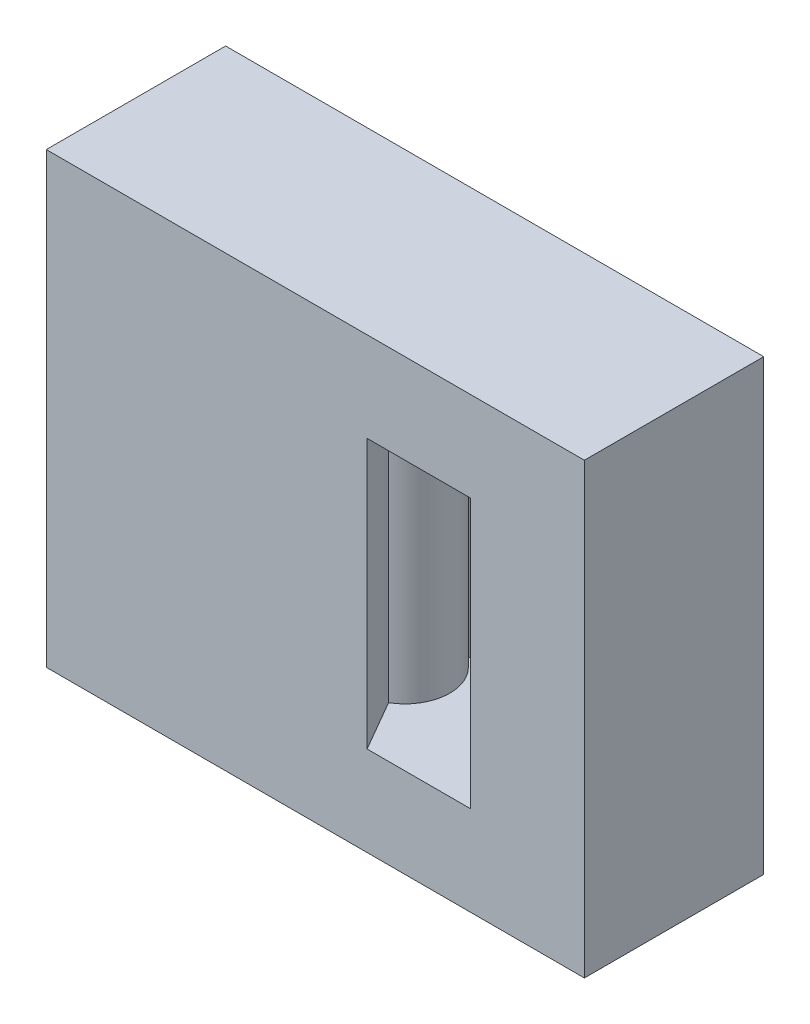
ISO-10303-21;
HEADER;
FILE_DESCRIPTION(('STEP AP214'),'2;1');
FILE_NAME('part.step','',(''),(''),'','','');
FILE_SCHEMA(('AUTOMOTIVE_DESIGN { 1 0 10303 214 1 1 1 1 }'));
ENDSEC;
DATA;
#1=APPLICATION_CONTEXT('core data for automotive mechanical design processes');
#2=APPLICATION_PROTOCOL_DEFINITION('international standard','automotive_design',2000,#1);
#3=PRODUCT_CONTEXT('',#1,'mechanical');
#4=PRODUCT('Part','Part','',(#3));
#5=PRODUCT_RELATED_PRODUCT_CATEGORY('part','',(#4));
#6=PRODUCT_DEFINITION_FORMATION('','',#4);
#7=PRODUCT_DEFINITION_CONTEXT('part definition',#1,'design');
#8=PRODUCT_DEFINITION('design','',#6,#7);
#9=PRODUCT_DEFINITION_SHAPE('','',#8);
#10=(LENGTH_UNIT() NAMED_UNIT(*) SI_UNIT(.MILLI.,.METRE.));
#11=(NAMED_UNIT(*) PLANE_ANGLE_UNIT() SI_UNIT($,.RADIAN.));
#12=(NAMED_UNIT(*) SI_UNIT($,.STERADIAN.) SOLID_ANGLE_UNIT());
#13=UNCERTAINTY_MEASURE_WITH_UNIT(LENGTH_MEASURE(1.E-05),#10,'distance_accuracy_value','');
#14=(GEOMETRIC_REPRESENTATION_CONTEXT(3) GLOBAL_UNCERTAINTY_ASSIGNED_CONTEXT((#13)) GLOBAL_UNIT_ASSIGNED_CONTEXT((#10,
#11,#12)) REPRESENTATION_CONTEXT('',''));
#15=CARTESIAN_POINT('',(0.,0.,0.));
#16=DIRECTION('',(0.,0.,1.));
#17=DIRECTION('',(1.,0.,0.));
#18=AXIS2_PLACEMENT_3D('',#15,#16,#17);
#19=CARTESIAN_POINT('',(-30.,40.,10.));
#20=DIRECTION('',(1.,0.,0.));
#21=DIRECTION('',(0.,0.,-1.));
#22=AXIS2_PLACEMENT_3D('',#19,#20,#21);
#23=PLANE('',#22);
#24=DIRECTION('',(0.,-1.,0.));
#25=VECTOR('',#24,1.);
#26=CARTESIAN_POINT('',(-30.,40.,-10.));
#27=LINE('',#26,#25);
#28=CARTESIAN_POINT('',(-30.,40.,-10.));
#29=VERTEX_POINT('',#28);
#30=CARTESIAN_POINT('',(-30.,-10.,-10.));
#31=VERTEX_POINT('',#30);
#32=EDGE_CURVE('E154',#29,#31,#27,.T.);
#33=ORIENTED_EDGE('',*,*,#32,.T.);
#34=DIRECTION('',(0.,0.,-1.));
#35=VECTOR('',#34,1.);
#36=CARTESIAN_POINT('',(-30.,-10.,10.));
#37=LINE('',#36,#35);
#38=CARTESIAN_POINT('',(-30.,-10.,10.));
#39=VERTEX_POINT('',#38);
#40=EDGE_CURVE('E181',#39,#31,#37,.T.);
#41=ORIENTED_EDGE('',*,*,#40,.F.);
#42=DIRECTION('',(0.,-1.,0.));
#43=VECTOR('',#42,1.);
#44=CARTESIAN_POINT('',(-30.,40.,10.));
#45=LINE('',#44,#43);
#46=CARTESIAN_POINT('',(-30.,40.,10.));
#47=VERTEX_POINT('',#46);
#48=EDGE_CURVE('E155',#47,#39,#45,.T.);
#49=ORIENTED_EDGE('',*,*,#48,.F.);
#50=DIRECTION('',(0.,0.,-1.));
#51=VECTOR('',#50,1.);
#52=CARTESIAN_POINT('',(-30.,40.,10.));
#53=LINE('',#52,#51);
#54=EDGE_CURVE('E165',#47,#29,#53,.T.);
#55=ORIENTED_EDGE('',*,*,#54,.T.);
#56=EDGE_LOOP('',(#33,#41,#49,#55));
#57=FACE_BOUND('',#56,.T.);
#58=ADVANCED_FACE('F41',(#57),#23,.F.);
#59=CARTESIAN_POINT('',(-30.,-10.,10.));
#60=DIRECTION('',(0.,1.,0.));
#61=DIRECTION('',(0.,0.,1.));
#62=AXIS2_PLACEMENT_3D('',#59,#60,#61);
#63=PLANE('',#62);
#64=DIRECTION('',(1.,0.,0.));
#65=VECTOR('',#64,1.);
#66=CARTESIAN_POINT('',(-30.,-10.,-10.));
#67=LINE('',#66,#65);
#68=CARTESIAN_POINT('',(30.,-10.,-10.));
#69=VERTEX_POINT('',#68);
#70=EDGE_CURVE('E168',#31,#69,#67,.T.);
#71=ORIENTED_EDGE('',*,*,#70,.T.);
#72=DIRECTION('',(0.,0.,-1.));
#73=VECTOR('',#72,1.);
#74=CARTESIAN_POINT('',(30.,-10.,10.));
#75=LINE('',#74,#73);
#76=CARTESIAN_POINT('',(30.,-10.,10.));
#77=VERTEX_POINT('',#76);
#78=EDGE_CURVE('E178',#77,#69,#75,.T.);
#79=ORIENTED_EDGE('',*,*,#78,.F.);
#80=DIRECTION('',(1.,0.,0.));
#81=VECTOR('',#80,1.);
#82=CARTESIAN_POINT('',(-30.,-10.,10.));
#83=LINE('',#82,#81);
#84=EDGE_CURVE('E158',#39,#77,#83,.T.);
#85=ORIENTED_EDGE('',*,*,#84,.F.);
#86=ORIENTED_EDGE('',*,*,#40,.T.);
#87=EDGE_LOOP('',(#71,#79,#85,#86));
#88=FACE_BOUND('',#87,.T.);
#89=ADVANCED_FACE('F219',(#88),#63,.F.);
#90=CARTESIAN_POINT('',(30.,-10.,10.));
#91=DIRECTION('',(-1.,0.,0.));
#92=DIRECTION('',(0.,0.,1.));
#93=AXIS2_PLACEMENT_3D('',#90,#91,#92);
#94=PLANE('',#93);
#95=DIRECTION('',(0.,1.,0.));
#96=VECTOR('',#95,1.);
#97=CARTESIAN_POINT('',(30.,-10.,-10.));
#98=LINE('',#97,#96);
#99=CARTESIAN_POINT('',(30.,40.,-10.));
#100=VERTEX_POINT('',#99);
#101=EDGE_CURVE('E170',#69,#100,#98,.T.);
#102=ORIENTED_EDGE('',*,*,#101,.T.);
#103=DIRECTION('',(0.,0.,-1.));
#104=VECTOR('',#103,1.);
#105=CARTESIAN_POINT('',(30.,40.,10.));
#106=LINE('',#105,#104);
#107=CARTESIAN_POINT('',(30.,40.,10.));
#108=VERTEX_POINT('',#107);
#109=EDGE_CURVE('E175',#108,#100,#106,.T.);
#110=ORIENTED_EDGE('',*,*,#109,.F.);
#111=DIRECTION('',(0.,1.,0.));
#112=VECTOR('',#111,1.);
#113=CARTESIAN_POINT('',(30.,-10.,10.));
#114=LINE('',#113,#112);
#115=EDGE_CURVE('E161',#77,#108,#114,.T.);
#116=ORIENTED_EDGE('',*,*,#115,.F.);
#117=ORIENTED_EDGE('',*,*,#78,.T.);
#118=EDGE_LOOP('',(#102,#110,#116,#117));
#119=FACE_BOUND('',#118,.T.);
#120=ADVANCED_FACE('F224',(#119),#94,.F.);
#121=CARTESIAN_POINT('',(30.,40.,10.));
#122=DIRECTION('',(0.,-1.,0.));
#123=DIRECTION('',(0.,0.,-1.));
#124=AXIS2_PLACEMENT_3D('',#121,#122,#123);
#125=PLANE('',#124);
#126=DIRECTION('',(-1.,0.,0.));
#127=VECTOR('',#126,1.);
#128=CARTESIAN_POINT('',(30.,40.,-10.));
#129=LINE('',#128,#127);
#130=EDGE_CURVE('E159',#100,#29,#129,.T.);
#131=ORIENTED_EDGE('',*,*,#130,.T.);
#132=ORIENTED_EDGE('',*,*,#54,.F.);
#133=DIRECTION('',(-1.,0.,0.));
#134=VECTOR('',#133,1.);
#135=CARTESIAN_POINT('',(30.,40.,10.));
#136=LINE('',#135,#134);
#137=EDGE_CURVE('E163',#108,#47,#136,.T.);
#138=ORIENTED_EDGE('',*,*,#137,.F.);
#139=ORIENTED_EDGE('',*,*,#109,.T.);
#140=EDGE_LOOP('',(#131,#132,#138,#139));
#141=FACE_BOUND('',#140,.T.);
#142=ADVANCED_FACE('F237',(#141),#125,.F.);
#143=CARTESIAN_POINT('',(0.,0.,10.));
#144=DIRECTION('',(0.,0.,1.));
#145=DIRECTION('',(1.,0.,0.));
#146=AXIS2_PLACEMENT_3D('',#143,#144,#145);
#147=PLANE('',#146);
#148=DIRECTION('',(1.,0.,0.));
#149=VECTOR('',#148,1.);
#150=CARTESIAN_POINT('',(0.,0.,10.));
#151=LINE('',#150,#149);
#152=CARTESIAN_POINT('',(5.77350269189626,0.,10.));
#153=VERTEX_POINT('',#152);
#154=CARTESIAN_POINT('',(17.3205080756888,0.,10.));
#155=VERTEX_POINT('',#154);
#156=EDGE_CURVE('E152',#153,#155,#151,.T.);
#157=ORIENTED_EDGE('',*,*,#156,.F.);
#158=DIRECTION('',(0.,-1.,0.));
#159=VECTOR('',#158,1.);
#160=CARTESIAN_POINT('',(5.77350269189626,0.,10.));
#161=LINE('',#160,#159);
#162=CARTESIAN_POINT('',(5.77350269189626,30.,10.));
#163=VERTEX_POINT('',#162);
#164=EDGE_CURVE('E11',#163,#153,#161,.T.);
#165=ORIENTED_EDGE('',*,*,#164,.F.);
#166=DIRECTION('',(-1.,0.,0.));
#167=VECTOR('',#166,1.);
#168=CARTESIAN_POINT('',(0.,30.,10.));
#169=LINE('',#168,#167);
#170=CARTESIAN_POINT('',(17.3205080756888,30.,10.));
#171=VERTEX_POINT('',#170);
#172=EDGE_CURVE('E124',#171,#163,#169,.T.);
#173=ORIENTED_EDGE('',*,*,#172,.F.);
#174=DIRECTION('',(0.,-1.,0.));
#175=VECTOR('',#174,1.);
#176=CARTESIAN_POINT('',(17.3205080756888,0.,10.));
#177=LINE('',#176,#175);
#178=EDGE_CURVE('E150',#155,#171,#177,.F.);
#179=ORIENTED_EDGE('',*,*,#178,.F.);
#180=EDGE_LOOP('',(#157,#165,#173,#179));
#181=FACE_BOUND('',#180,.T.);
#182=ORIENTED_EDGE('',*,*,#48,.T.);
#183=ORIENTED_EDGE('',*,*,#84,.T.);
#184=ORIENTED_EDGE('',*,*,#115,.T.);
#185=ORIENTED_EDGE('',*,*,#137,.T.);
#186=EDGE_LOOP('',(#182,#183,#184,#185));
#187=FACE_BOUND('',#186,.T.);
#188=ADVANCED_FACE('F203',(#181,#187),#147,.T.);
#189=CARTESIAN_POINT('',(0.,0.,-10.));
#190=DIRECTION('',(0.,0.,1.));
#191=DIRECTION('',(1.,0.,0.));
#192=AXIS2_PLACEMENT_3D('',#189,#190,#191);
#193=PLANE('',#192);
#194=DIRECTION('',(0.,1.,0.));
#195=VECTOR('',#194,1.);
#196=CARTESIAN_POINT('',(5.77350269189626,0.,-10.));
#197=LINE('',#196,#195);
#198=CARTESIAN_POINT('',(5.77350269189626,0.,-10.));
#199=VERTEX_POINT('',#198);
#200=CARTESIAN_POINT('',(5.77350269189626,30.,-10.));
#201=VERTEX_POINT('',#200);
#202=EDGE_CURVE('E184',#199,#201,#197,.T.);
#203=ORIENTED_EDGE('',*,*,#202,.F.);
#204=DIRECTION('',(1.,0.,0.));
#205=VECTOR('',#204,1.);
#206=CARTESIAN_POINT('',(0.,0.,-10.));
#207=LINE('',#206,#205);
#208=CARTESIAN_POINT('',(17.3205080756888,0.,-10.));
#209=VERTEX_POINT('',#208);
#210=EDGE_CURVE('E48',#199,#209,#207,.T.);
#211=ORIENTED_EDGE('',*,*,#210,.T.);
#212=DIRECTION('',(0.,-1.,0.));
#213=VECTOR('',#212,1.);
#214=CARTESIAN_POINT('',(17.3205080756888,0.,-10.));
#215=LINE('',#214,#213);
#216=CARTESIAN_POINT('',(17.3205080756888,30.,-10.));
#217=VERTEX_POINT('',#216);
#218=EDGE_CURVE('E189',#209,#217,#215,.F.);
#219=ORIENTED_EDGE('',*,*,#218,.T.);
#220=DIRECTION('',(-1.,0.,0.));
#221=VECTOR('',#220,1.);
#222=CARTESIAN_POINT('',(0.,30.,-10.));
#223=LINE('',#222,#221);
#224=EDGE_CURVE('E186',#217,#201,#223,.T.);
#225=ORIENTED_EDGE('',*,*,#224,.T.);
#226=EDGE_LOOP('',(#203,#211,#219,#225));
#227=FACE_BOUND('',#226,.T.);
#228=ORIENTED_EDGE('',*,*,#32,.F.);
#229=ORIENTED_EDGE('',*,*,#130,.F.);
#230=ORIENTED_EDGE('',*,*,#101,.F.);
#231=ORIENTED_EDGE('',*,*,#70,.F.);
#232=EDGE_LOOP('',(#228,#229,#230,#231));
#233=FACE_BOUND('',#232,.T.);
#234=ADVANCED_FACE('F194',(#227,#233),#193,.F.);
#235=CARTESIAN_POINT('',(2.5,0.,-4.33012701892219));
#236=DIRECTION('',(0.,-1.,0.));
#237=DIRECTION('',(0.,0.,-1.));
#238=AXIS2_PLACEMENT_3D('',#235,#236,#237);
#239=PLANE('',#238);
#240=ORIENTED_EDGE('',*,*,#156,.T.);
#241=CARTESIAN_POINT('',(0.,0.,0.));
#242=DIRECTION('',(0.,-1.,0.));
#243=DIRECTION('',(0.,0.,-1.));
#244=AXIS2_PLACEMENT_3D('',#241,#242,#243);
#245=CIRCLE('',#244,20.);
#246=EDGE_CURVE('E125',#209,#155,#245,.T.);
#247=ORIENTED_EDGE('',*,*,#246,.F.);
#248=ORIENTED_EDGE('',*,*,#210,.F.);
#249=DIRECTION('',(0.5,0.,-0.866025403784439));
#250=VECTOR('',#249,1.);
#251=CARTESIAN_POINT('',(2.5,0.,-4.33012701892219));
#252=LINE('',#251,#250);
#253=CARTESIAN_POINT('',(2.5,0.,-4.33012701892219));
#254=VERTEX_POINT('',#253);
#255=EDGE_CURVE('E62',#254,#199,#252,.T.);
#256=ORIENTED_EDGE('',*,*,#255,.F.);
#257=CARTESIAN_POINT('',(0.,0.,0.));
#258=DIRECTION('',(0.,-1.,0.));
#259=DIRECTION('',(0.,0.,-1.));
#260=AXIS2_PLACEMENT_3D('',#257,#258,#259);
#261=CIRCLE('',#260,5.);
#262=CARTESIAN_POINT('',(2.5,0.,4.33012701892219));
#263=VERTEX_POINT('',#262);
#264=EDGE_CURVE('E116',#254,#263,#261,.T.);
#265=ORIENTED_EDGE('',*,*,#264,.T.);
#266=DIRECTION('',(0.5,0.,0.866025403784439));
#267=VECTOR('',#266,1.);
#268=CARTESIAN_POINT('',(2.5,0.,4.33012701892219));
#269=LINE('',#268,#267);
#270=EDGE_CURVE('E120',#263,#153,#269,.T.);
#271=ORIENTED_EDGE('',*,*,#270,.T.);
#272=EDGE_LOOP('',(#240,#247,#248,#256,#265,#271));
#273=FACE_BOUND('',#272,.T.);
#274=ADVANCED_FACE('F118',(#273),#239,.F.);
#275=CARTESIAN_POINT('',(0.,0.,0.));
#276=DIRECTION('',(0.,-1.,0.));
#277=DIRECTION('',(0.,0.,-1.));
#278=AXIS2_PLACEMENT_3D('',#275,#276,#277);
#279=CYLINDRICAL_SURFACE('',#278,20.);
#280=ORIENTED_EDGE('',*,*,#178,.T.);
#281=CARTESIAN_POINT('',(0.,30.,0.));
#282=DIRECTION('',(0.,-1.,0.));
#283=DIRECTION('',(0.,0.,-1.));
#284=AXIS2_PLACEMENT_3D('',#281,#282,#283);
#285=CIRCLE('',#284,20.);
#286=EDGE_CURVE('E144',#217,#171,#285,.T.);
#287=ORIENTED_EDGE('',*,*,#286,.F.);
#288=ORIENTED_EDGE('',*,*,#218,.F.);
#289=ORIENTED_EDGE('',*,*,#246,.T.);
#290=EDGE_LOOP('',(#280,#287,#288,#289));
#291=FACE_BOUND('',#290,.T.);
#292=ADVANCED_FACE('F199',(#291),#279,.F.);
#293=CARTESIAN_POINT('',(10.,30.,-17.3205080756888));
#294=DIRECTION('',(0.,1.,0.));
#295=DIRECTION('',(0.,0.,1.));
#296=AXIS2_PLACEMENT_3D('',#293,#294,#295);
#297=PLANE('',#296);
#298=ORIENTED_EDGE('',*,*,#172,.T.);
#299=DIRECTION('',(-0.5,0.,-0.866025403784439));
#300=VECTOR('',#299,1.);
#301=CARTESIAN_POINT('',(10.,30.,17.3205080756888));
#302=LINE('',#301,#300);
#303=CARTESIAN_POINT('',(2.5,30.,4.33012701892219));
#304=VERTEX_POINT('',#303);
#305=EDGE_CURVE('E54',#163,#304,#302,.T.);
#306=ORIENTED_EDGE('',*,*,#305,.T.);
#307=CARTESIAN_POINT('',(0.,30.,0.));
#308=DIRECTION('',(0.,-1.,0.));
#309=DIRECTION('',(0.,0.,-1.));
#310=AXIS2_PLACEMENT_3D('',#307,#308,#309);
#311=CIRCLE('',#310,5.);
#312=CARTESIAN_POINT('',(2.5,30.,-4.33012701892219));
#313=VERTEX_POINT('',#312);
#314=EDGE_CURVE('E131',#313,#304,#311,.T.);
#315=ORIENTED_EDGE('',*,*,#314,.F.);
#316=DIRECTION('',(-0.5,0.,0.866025403784439));
#317=VECTOR('',#316,1.);
#318=CARTESIAN_POINT('',(10.,30.,-17.3205080756888));
#319=LINE('',#318,#317);
#320=EDGE_CURVE('E141',#201,#313,#319,.T.);
#321=ORIENTED_EDGE('',*,*,#320,.F.);
#322=ORIENTED_EDGE('',*,*,#224,.F.);
#323=ORIENTED_EDGE('',*,*,#286,.T.);
#324=EDGE_LOOP('',(#298,#306,#315,#321,#322,#323));
#325=FACE_BOUND('',#324,.T.);
#326=ADVANCED_FACE('F206',(#325),#297,.F.);
#327=CARTESIAN_POINT('',(0.,0.,0.));
#328=DIRECTION('',(0.866025403784439,0.,0.5));
#329=DIRECTION('',(0.5,0.,-0.866025403784439));
#330=AXIS2_PLACEMENT_3D('',#327,#328,#329);
#331=PLANE('',#330);
#332=ORIENTED_EDGE('',*,*,#202,.T.);
#333=ORIENTED_EDGE('',*,*,#320,.T.);
#334=DIRECTION('',(0.,-1.,0.));
#335=VECTOR('',#334,1.);
#336=CARTESIAN_POINT('',(2.5,30.,-4.33012701892219));
#337=LINE('',#336,#335);
#338=EDGE_CURVE('E136',#313,#254,#337,.T.);
#339=ORIENTED_EDGE('',*,*,#338,.T.);
#340=ORIENTED_EDGE('',*,*,#255,.T.);
#341=EDGE_LOOP('',(#332,#333,#339,#340));
#342=FACE_BOUND('',#341,.T.);
#343=ADVANCED_FACE('F208',(#342),#331,.T.);
#344=CARTESIAN_POINT('',(0.,0.,0.));
#345=DIRECTION('',(0.,-1.,0.));
#346=DIRECTION('',(0.,0.,-1.));
#347=AXIS2_PLACEMENT_3D('',#344,#345,#346);
#348=CYLINDRICAL_SURFACE('',#347,5.);
#349=ORIENTED_EDGE('',*,*,#264,.F.);
#350=ORIENTED_EDGE('',*,*,#338,.F.);
#351=ORIENTED_EDGE('',*,*,#314,.T.);
#352=DIRECTION('',(0.,-1.,0.));
#353=VECTOR('',#352,1.);
#354=CARTESIAN_POINT('',(2.5,30.,4.33012701892219));
#355=LINE('',#354,#353);
#356=EDGE_CURVE('E128',#304,#263,#355,.T.);
#357=ORIENTED_EDGE('',*,*,#356,.T.);
#358=EDGE_LOOP('',(#349,#350,#351,#357));
#359=FACE_BOUND('',#358,.T.);
#360=ADVANCED_FACE('F129',(#359),#348,.T.);
#361=CARTESIAN_POINT('',(0.,0.,0.));
#362=DIRECTION('',(-0.866025403784439,0.,0.5));
#363=DIRECTION('',(0.5,0.,0.866025403784439));
#364=AXIS2_PLACEMENT_3D('',#361,#362,#363);
#365=PLANE('',#364);
#366=ORIENTED_EDGE('',*,*,#164,.T.);
#367=ORIENTED_EDGE('',*,*,#270,.F.);
#368=ORIENTED_EDGE('',*,*,#356,.F.);
#369=ORIENTED_EDGE('',*,*,#305,.F.);
#370=EDGE_LOOP('',(#366,#367,#368,#369));
#371=FACE_BOUND('',#370,.T.);
#372=ADVANCED_FACE('F133',(#371),#365,.F.);
#373=CLOSED_SHELL('',(#58,#89,#120,#142,#188,#234,#274,#292,#326,#343,#360,#372));
#374=MANIFOLD_SOLID_BREP('B2',#373);
#375=ADVANCED_BREP_SHAPE_REPRESENTATION('',(#18,#374),#14);
#376=SHAPE_DEFINITION_REPRESENTATION(#9,#375);
ENDSEC;
END-ISO-10303-21;
